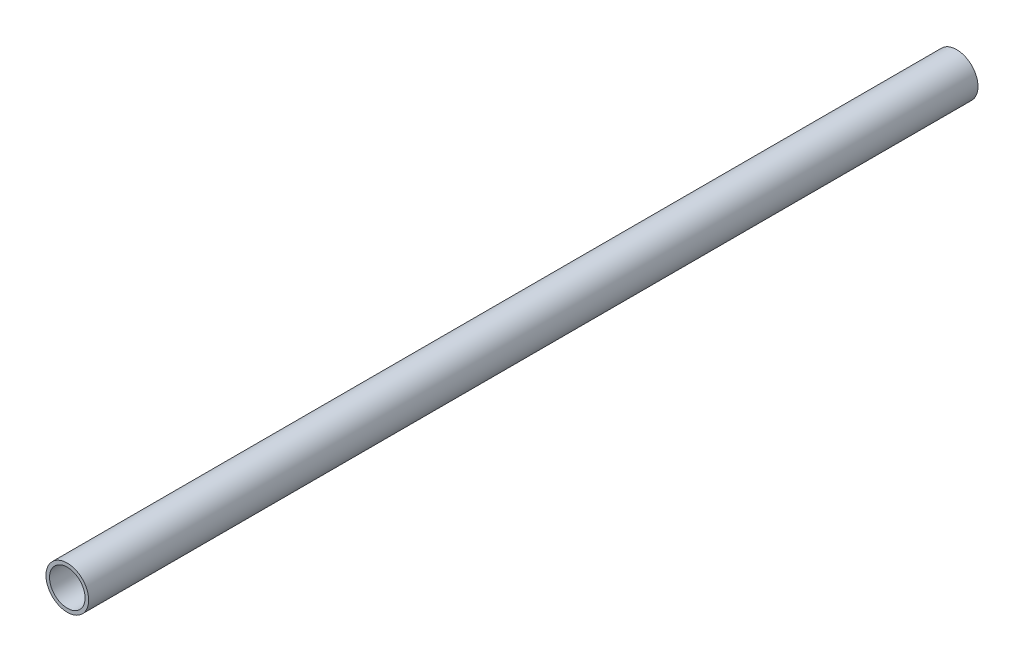
ISO-10303-21;
HEADER;
FILE_DESCRIPTION(('STEP AP214'),'2;1');
FILE_NAME('part.step','',(''),(''),'','','');
FILE_SCHEMA(('AUTOMOTIVE_DESIGN { 1 0 10303 214 1 1 1 1 }'));
ENDSEC;
DATA;
#1=APPLICATION_CONTEXT('core data for automotive mechanical design processes');
#2=APPLICATION_PROTOCOL_DEFINITION('international standard','automotive_design',2000,#1);
#3=PRODUCT_CONTEXT('',#1,'mechanical');
#4=PRODUCT('Part','Part','',(#3));
#5=PRODUCT_RELATED_PRODUCT_CATEGORY('part','',(#4));
#6=PRODUCT_DEFINITION_FORMATION('','',#4);
#7=PRODUCT_DEFINITION_CONTEXT('part definition',#1,'design');
#8=PRODUCT_DEFINITION('design','',#6,#7);
#9=PRODUCT_DEFINITION_SHAPE('','',#8);
#10=(LENGTH_UNIT() NAMED_UNIT(*) SI_UNIT(.MILLI.,.METRE.));
#11=(NAMED_UNIT(*) PLANE_ANGLE_UNIT() SI_UNIT($,.RADIAN.));
#12=(NAMED_UNIT(*) SI_UNIT($,.STERADIAN.) SOLID_ANGLE_UNIT());
#13=UNCERTAINTY_MEASURE_WITH_UNIT(LENGTH_MEASURE(1.E-05),#10,'distance_accuracy_value','');
#14=(GEOMETRIC_REPRESENTATION_CONTEXT(3) GLOBAL_UNCERTAINTY_ASSIGNED_CONTEXT((#13)) GLOBAL_UNIT_ASSIGNED_CONTEXT((#10,
#11,#12)) REPRESENTATION_CONTEXT('',''));
#15=CARTESIAN_POINT('',(0.,0.,0.));
#16=DIRECTION('',(0.,0.,1.));
#17=DIRECTION('',(1.,0.,0.));
#18=AXIS2_PLACEMENT_3D('',#15,#16,#17);
#19=CARTESIAN_POINT('',(0.,0.,125.));
#20=DIRECTION('',(0.,0.,1.));
#21=DIRECTION('',(1.,0.,0.));
#22=AXIS2_PLACEMENT_3D('',#19,#20,#21);
#23=PLANE('',#22);
#24=CARTESIAN_POINT('',(0.,0.,125.));
#25=DIRECTION('',(0.,0.,1.));
#26=DIRECTION('',(1.,0.,0.));
#27=AXIS2_PLACEMENT_3D('',#24,#25,#26);
#28=CIRCLE('',#27,6.);
#29=CARTESIAN_POINT('',(6.,0.,125.));
#30=VERTEX_POINT('',#29);
#31=EDGE_CURVE('E10',#30,#30,#28,.T.);
#32=ORIENTED_EDGE('',*,*,#31,.T.);
#33=EDGE_LOOP('',(#32));
#34=FACE_BOUND('',#33,.T.);
#35=CARTESIAN_POINT('',(0.,0.,125.));
#36=DIRECTION('',(0.,0.,1.));
#37=DIRECTION('',(1.,0.,0.));
#38=AXIS2_PLACEMENT_3D('',#35,#36,#37);
#39=CIRCLE('',#38,5.);
#40=CARTESIAN_POINT('',(5.,0.,125.));
#41=VERTEX_POINT('',#40);
#42=EDGE_CURVE('E54',#41,#41,#39,.T.);
#43=ORIENTED_EDGE('',*,*,#42,.F.);
#44=EDGE_LOOP('',(#43));
#45=FACE_BOUND('',#44,.T.);
#46=ADVANCED_FACE('F39',(#34,#45),#23,.T.);
#47=CARTESIAN_POINT('',(0.,0.,-125.));
#48=DIRECTION('',(0.,0.,1.));
#49=DIRECTION('',(1.,0.,0.));
#50=AXIS2_PLACEMENT_3D('',#47,#48,#49);
#51=PLANE('',#50);
#52=CARTESIAN_POINT('',(0.,0.,-125.));
#53=DIRECTION('',(0.,0.,1.));
#54=DIRECTION('',(1.,0.,0.));
#55=AXIS2_PLACEMENT_3D('',#52,#53,#54);
#56=CIRCLE('',#55,6.);
#57=CARTESIAN_POINT('',(6.,0.,-125.));
#58=VERTEX_POINT('',#57);
#59=EDGE_CURVE('E43',#58,#58,#56,.T.);
#60=ORIENTED_EDGE('',*,*,#59,.F.);
#61=EDGE_LOOP('',(#60));
#62=FACE_BOUND('',#61,.T.);
#63=CARTESIAN_POINT('',(0.,0.,-125.));
#64=DIRECTION('',(0.,0.,1.));
#65=DIRECTION('',(1.,0.,0.));
#66=AXIS2_PLACEMENT_3D('',#63,#64,#65);
#67=CIRCLE('',#66,5.);
#68=CARTESIAN_POINT('',(5.,0.,-125.));
#69=VERTEX_POINT('',#68);
#70=EDGE_CURVE('E56',#69,#69,#67,.T.);
#71=ORIENTED_EDGE('',*,*,#70,.T.);
#72=EDGE_LOOP('',(#71));
#73=FACE_BOUND('',#72,.T.);
#74=ADVANCED_FACE('F66',(#62,#73),#51,.F.);
#75=CARTESIAN_POINT('',(0.,0.,125.));
#76=DIRECTION('',(0.,0.,-1.));
#77=DIRECTION('',(-1.,0.,0.));
#78=AXIS2_PLACEMENT_3D('',#75,#76,#77);
#79=CYLINDRICAL_SURFACE('',#78,6.);
#80=ORIENTED_EDGE('',*,*,#31,.F.);
#81=EDGE_LOOP('',(#80));
#82=FACE_BOUND('',#81,.T.);
#83=ORIENTED_EDGE('',*,*,#59,.T.);
#84=EDGE_LOOP('',(#83));
#85=FACE_BOUND('',#84,.T.);
#86=ADVANCED_FACE('F41',(#82,#85),#79,.T.);
#87=CARTESIAN_POINT('',(0.,0.,125.));
#88=DIRECTION('',(0.,0.,-1.));
#89=DIRECTION('',(-1.,0.,0.));
#90=AXIS2_PLACEMENT_3D('',#87,#88,#89);
#91=CYLINDRICAL_SURFACE('',#90,5.);
#92=ORIENTED_EDGE('',*,*,#42,.T.);
#93=EDGE_LOOP('',(#92));
#94=FACE_BOUND('',#93,.T.);
#95=ORIENTED_EDGE('',*,*,#70,.F.);
#96=EDGE_LOOP('',(#95));
#97=FACE_BOUND('',#96,.T.);
#98=ADVANCED_FACE('F62',(#94,#97),#91,.F.);
#99=CLOSED_SHELL('',(#46,#74,#86,#98));
#100=MANIFOLD_SOLID_BREP('B2',#99);
#101=ADVANCED_BREP_SHAPE_REPRESENTATION('',(#18,#100),#14);
#102=SHAPE_DEFINITION_REPRESENTATION(#9,#101);
ENDSEC;
END-ISO-10303-21;
